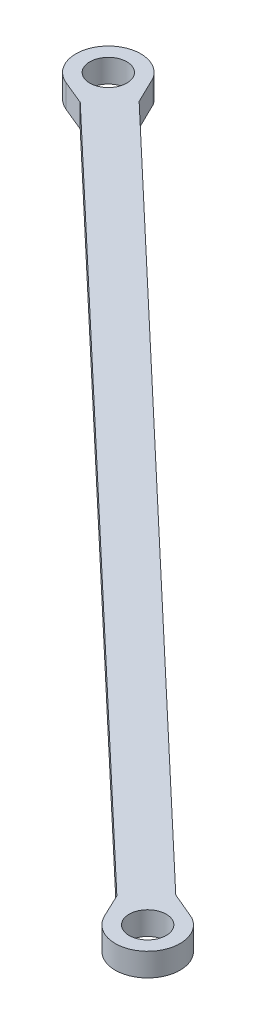
ISO-10303-21;
HEADER;
FILE_DESCRIPTION(('STEP AP214'),'2;1');
FILE_NAME('part.step','',(''),(''),'','','');
FILE_SCHEMA(('AUTOMOTIVE_DESIGN { 1 0 10303 214 1 1 1 1 }'));
ENDSEC;
DATA;
#1=APPLICATION_CONTEXT('core data for automotive mechanical design processes');
#2=APPLICATION_PROTOCOL_DEFINITION('international standard','automotive_design',2000,#1);
#3=PRODUCT_CONTEXT('',#1,'mechanical');
#4=PRODUCT('Part','Part','',(#3));
#5=PRODUCT_RELATED_PRODUCT_CATEGORY('part','',(#4));
#6=PRODUCT_DEFINITION_FORMATION('','',#4);
#7=PRODUCT_DEFINITION_CONTEXT('part definition',#1,'design');
#8=PRODUCT_DEFINITION('design','',#6,#7);
#9=PRODUCT_DEFINITION_SHAPE('','',#8);
#10=(LENGTH_UNIT() NAMED_UNIT(*) SI_UNIT(.MILLI.,.METRE.));
#11=(NAMED_UNIT(*) PLANE_ANGLE_UNIT() SI_UNIT($,.RADIAN.));
#12=(NAMED_UNIT(*) SI_UNIT($,.STERADIAN.) SOLID_ANGLE_UNIT());
#13=UNCERTAINTY_MEASURE_WITH_UNIT(LENGTH_MEASURE(1.E-05),#10,'distance_accuracy_value','');
#14=(GEOMETRIC_REPRESENTATION_CONTEXT(3) GLOBAL_UNCERTAINTY_ASSIGNED_CONTEXT((#13)) GLOBAL_UNIT_ASSIGNED_CONTEXT((#10,
#11,#12)) REPRESENTATION_CONTEXT('',''));
#15=CARTESIAN_POINT('',(0.,0.,0.));
#16=DIRECTION('',(0.,0.,1.));
#17=DIRECTION('',(1.,0.,0.));
#18=AXIS2_PLACEMENT_3D('',#15,#16,#17);
#19=CARTESIAN_POINT('',(-84.9502127526354,5.,-62.4655358947094));
#20=DIRECTION('',(0.,-1.,0.));
#21=DIRECTION('',(0.,0.,-1.));
#22=AXIS2_PLACEMENT_3D('',#19,#20,#21);
#23=CYLINDRICAL_SURFACE('',#22,7.);
#24=CARTESIAN_POINT('',(-84.9502127526354,0.,-62.4655358947094));
#25=DIRECTION('',(0.,1.,0.));
#26=DIRECTION('',(0.,0.,1.));
#27=AXIS2_PLACEMENT_3D('',#24,#25,#26);
#28=CIRCLE('',#27,7.);
#29=CARTESIAN_POINT('',(-79.0797574527234,0.,-66.2783766429882));
#30=VERTEX_POINT('',#29);
#31=CARTESIAN_POINT('',(-87.6194900154727,0.,-55.9944495180568));
#32=VERTEX_POINT('',#31);
#33=EDGE_CURVE('E141',#30,#32,#28,.T.);
#34=ORIENTED_EDGE('',*,*,#33,.T.);
#35=DIRECTION('',(0.,-1.,0.));
#36=VECTOR('',#35,1.);
#37=CARTESIAN_POINT('',(-87.6194900154727,5.,-55.9944495180568));
#38=LINE('',#37,#36);
#39=CARTESIAN_POINT('',(-87.6194900154727,5.,-55.9944495180568));
#40=VERTEX_POINT('',#39);
#41=EDGE_CURVE('E11',#40,#32,#38,.T.);
#42=ORIENTED_EDGE('',*,*,#41,.F.);
#43=CARTESIAN_POINT('',(-84.9502127526354,5.,-62.4655358947094));
#44=DIRECTION('',(0.,1.,0.));
#45=DIRECTION('',(0.,0.,1.));
#46=AXIS2_PLACEMENT_3D('',#43,#44,#45);
#47=CIRCLE('',#46,7.);
#48=CARTESIAN_POINT('',(-79.0797574527234,5.,-66.2783766429882));
#49=VERTEX_POINT('',#48);
#50=EDGE_CURVE('E186',#49,#40,#47,.T.);
#51=ORIENTED_EDGE('',*,*,#50,.F.);
#52=DIRECTION('',(0.,-1.,0.));
#53=VECTOR('',#52,1.);
#54=CARTESIAN_POINT('',(-79.0797574527234,5.,-66.2783766429882));
#55=LINE('',#54,#53);
#56=EDGE_CURVE('E54',#49,#30,#55,.T.);
#57=ORIENTED_EDGE('',*,*,#56,.T.);
#58=EDGE_LOOP('',(#34,#42,#51,#57));
#59=FACE_BOUND('',#58,.T.);
#60=ADVANCED_FACE('F37',(#59),#23,.T.);
#61=CARTESIAN_POINT('',(6.9980936069278,5.,-16.965366930146));
#62=DIRECTION('',(0.381325323262473,0.,-0.924440910950381));
#63=DIRECTION('',(-0.924440910950381,0.,-0.381325323262473));
#64=AXIS2_PLACEMENT_3D('',#61,#62,#63);
#65=PLANE('',#64);
#66=DIRECTION('',(0.924440910950381,0.,0.381325323262473));
#67=VECTOR('',#66,1.);
#68=CARTESIAN_POINT('',(6.9980936069278,0.,-16.965366930146));
#69=LINE('',#68,#67);
#70=CARTESIAN_POINT('',(-82.3900625199584,0.,-53.8373477427204));
#71=VERTEX_POINT('',#70);
#72=EDGE_CURVE('E143',#32,#71,#69,.T.);
#73=ORIENTED_EDGE('',*,*,#72,.T.);
#74=DIRECTION('',(0.,-1.,0.));
#75=VECTOR('',#74,1.);
#76=CARTESIAN_POINT('',(-82.3900625199584,5.,-53.8373477427204));
#77=LINE('',#76,#75);
#78=CARTESIAN_POINT('',(-82.3900625199584,5.,-53.8373477427204));
#79=VERTEX_POINT('',#78);
#80=EDGE_CURVE('E46',#79,#71,#77,.T.);
#81=ORIENTED_EDGE('',*,*,#80,.F.);
#82=DIRECTION('',(0.924440910950381,0.,0.381325323262473));
#83=VECTOR('',#82,1.);
#84=CARTESIAN_POINT('',(6.9980936069278,5.,-16.965366930146));
#85=LINE('',#84,#83);
#86=EDGE_CURVE('E92',#40,#79,#85,.T.);
#87=ORIENTED_EDGE('',*,*,#86,.F.);
#88=ORIENTED_EDGE('',*,*,#41,.T.);
#89=EDGE_LOOP('',(#73,#81,#87,#88));
#90=FACE_BOUND('',#89,.T.);
#91=ADVANCED_FACE('F215',(#90),#65,.F.);
#92=CARTESIAN_POINT('',(-12.1203333633261,5.,12.7840659046511));
#93=DIRECTION('',(0.688017223548878,0.,-0.725694357219411));
#94=DIRECTION('',(-0.725694357219411,0.,-0.688017223548878));
#95=AXIS2_PLACEMENT_3D('',#92,#93,#94);
#96=PLANE('',#95);
#97=DIRECTION('',(0.725694357219411,0.,0.688017223548878));
#98=VECTOR('',#97,1.);
#99=CARTESIAN_POINT('',(-12.1203333633261,0.,12.7840659046511));
#100=LINE('',#99,#98);
#101=CARTESIAN_POINT('',(70.0057524961178,0.,90.6462692025439));
#102=VERTEX_POINT('',#101);
#103=EDGE_CURVE('E145',#71,#102,#100,.T.);
#104=ORIENTED_EDGE('',*,*,#103,.T.);
#105=DIRECTION('',(0.,-1.,0.));
#106=VECTOR('',#105,1.);
#107=CARTESIAN_POINT('',(70.0057524961178,5.,90.6462692025439));
#108=LINE('',#107,#106);
#109=CARTESIAN_POINT('',(70.0057524961178,5.,90.6462692025439));
#110=VERTEX_POINT('',#109);
#111=EDGE_CURVE('E166',#110,#102,#108,.T.);
#112=ORIENTED_EDGE('',*,*,#111,.F.);
#113=DIRECTION('',(0.725694357219411,0.,0.688017223548878));
#114=VECTOR('',#113,1.);
#115=CARTESIAN_POINT('',(-12.1203333633261,5.,12.7840659046511));
#116=LINE('',#115,#114);
#117=EDGE_CURVE('E173',#79,#110,#116,.T.);
#118=ORIENTED_EDGE('',*,*,#117,.F.);
#119=ORIENTED_EDGE('',*,*,#80,.T.);
#120=EDGE_LOOP('',(#104,#112,#118,#119));
#121=FACE_BOUND('',#120,.T.);
#122=ADVANCED_FACE('F171',(#121),#96,.F.);
#123=CARTESIAN_POINT('',(21.8683573127353,5.,-10.4161898300447));
#124=DIRECTION('',(-0.902817464803124,0.,0.430023982175949));
#125=DIRECTION('',(0.430023982175949,0.,0.902817464803124));
#126=AXIS2_PLACEMENT_3D('',#123,#124,#125);
#127=PLANE('',#126);
#128=DIRECTION('',(-0.430023982175949,0.,-0.902817464803124));
#129=VECTOR('',#128,1.);
#130=CARTESIAN_POINT('',(21.8683573127353,0.,-10.4161898300447));
#131=LINE('',#130,#129);
#132=CARTESIAN_POINT('',(72.4383354870735,0.,95.7533760148314));
#133=VERTEX_POINT('',#132);
#134=EDGE_CURVE('E148',#133,#102,#131,.T.);
#135=ORIENTED_EDGE('',*,*,#134,.F.);
#136=DIRECTION('',(0.,-1.,0.));
#137=VECTOR('',#136,1.);
#138=CARTESIAN_POINT('',(72.4383354870735,5.,95.7533760148314));
#139=LINE('',#138,#137);
#140=CARTESIAN_POINT('',(72.4383354870735,5.,95.7533760148314));
#141=VERTEX_POINT('',#140);
#142=EDGE_CURVE('E164',#141,#133,#139,.T.);
#143=ORIENTED_EDGE('',*,*,#142,.F.);
#144=DIRECTION('',(-0.430023982175949,0.,-0.902817464803124));
#145=VECTOR('',#144,1.);
#146=CARTESIAN_POINT('',(21.8683573127353,5.,-10.4161898300447));
#147=LINE('',#146,#145);
#148=EDGE_CURVE('E181',#141,#110,#147,.T.);
#149=ORIENTED_EDGE('',*,*,#148,.T.);
#150=ORIENTED_EDGE('',*,*,#111,.T.);
#151=EDGE_LOOP('',(#135,#143,#149,#150));
#152=FACE_BOUND('',#151,.T.);
#153=ADVANCED_FACE('F179',(#152),#127,.T.);
#154=CARTESIAN_POINT('',(78.7580577406953,5.,92.7432081395998));
#155=DIRECTION('',(0.,-1.,0.));
#156=DIRECTION('',(0.,0.,-1.));
#157=AXIS2_PLACEMENT_3D('',#154,#155,#156);
#158=CYLINDRICAL_SURFACE('',#157,7.00000000000001);
#159=CARTESIAN_POINT('',(78.7580577406953,0.,92.7432081395998));
#160=DIRECTION('',(0.,1.,0.));
#161=DIRECTION('',(0.,0.,1.));
#162=AXIS2_PLACEMENT_3D('',#159,#160,#161);
#163=CIRCLE('',#162,7.00000000000001);
#164=CARTESIAN_POINT('',(82.2527984538102,0.,86.6779969027097));
#165=VERTEX_POINT('',#164);
#166=EDGE_CURVE('E151',#165,#133,#163,.F.);
#167=ORIENTED_EDGE('',*,*,#166,.F.);
#168=DIRECTION('',(0.,-1.,0.));
#169=VECTOR('',#168,1.);
#170=CARTESIAN_POINT('',(82.2527984538102,5.,86.6779969027097));
#171=LINE('',#170,#169);
#172=CARTESIAN_POINT('',(82.2527984538102,5.,86.6779969027097));
#173=VERTEX_POINT('',#172);
#174=EDGE_CURVE('E127',#173,#165,#171,.T.);
#175=ORIENTED_EDGE('',*,*,#174,.F.);
#176=CARTESIAN_POINT('',(78.7580577406953,5.,92.7432081395998));
#177=DIRECTION('',(0.,1.,0.));
#178=DIRECTION('',(0.,0.,1.));
#179=AXIS2_PLACEMENT_3D('',#176,#177,#178);
#180=CIRCLE('',#179,7.00000000000001);
#181=EDGE_CURVE('E117',#173,#141,#180,.F.);
#182=ORIENTED_EDGE('',*,*,#181,.T.);
#183=ORIENTED_EDGE('',*,*,#142,.T.);
#184=EDGE_LOOP('',(#167,#175,#182,#183));
#185=FACE_BOUND('',#184,.T.);
#186=ADVANCED_FACE('F225',(#185),#158,.T.);
#187=CARTESIAN_POINT('',(-18.6166961542364,5.,43.9809131007848));
#188=DIRECTION('',(-0.389806690371797,0.,0.920896706553664));
#189=DIRECTION('',(0.920896706553664,0.,0.389806690371797));
#190=AXIS2_PLACEMENT_3D('',#187,#188,#189);
#191=PLANE('',#190);
#192=DIRECTION('',(-0.920896706553664,0.,-0.389806690371797));
#193=VECTOR('',#192,1.);
#194=CARTESIAN_POINT('',(-18.6166961542364,0.,43.9809131007848));
#195=LINE('',#194,#193);
#196=CARTESIAN_POINT('',(76.1979075080577,0.,84.1150199875692));
#197=VERTEX_POINT('',#196);
#198=EDGE_CURVE('E124',#165,#197,#195,.T.);
#199=ORIENTED_EDGE('',*,*,#198,.T.);
#200=DIRECTION('',(0.,-1.,0.));
#201=VECTOR('',#200,1.);
#202=CARTESIAN_POINT('',(76.1979075080577,5.,84.1150199875692));
#203=LINE('',#202,#201);
#204=CARTESIAN_POINT('',(76.1979075080577,5.,84.1150199875692));
#205=VERTEX_POINT('',#204);
#206=EDGE_CURVE('E121',#205,#197,#203,.T.);
#207=ORIENTED_EDGE('',*,*,#206,.F.);
#208=DIRECTION('',(-0.920896706553664,0.,-0.389806690371797));
#209=VECTOR('',#208,1.);
#210=CARTESIAN_POINT('',(-18.6166961542364,5.,43.9809131007848));
#211=LINE('',#210,#209);
#212=EDGE_CURVE('E109',#173,#205,#211,.T.);
#213=ORIENTED_EDGE('',*,*,#212,.F.);
#214=ORIENTED_EDGE('',*,*,#174,.T.);
#215=EDGE_LOOP('',(#199,#207,#213,#214));
#216=FACE_BOUND('',#215,.T.);
#217=ADVANCED_FACE('F122',(#216),#191,.F.);
#218=CARTESIAN_POINT('',(-5.92817835138624,5.,6.25281668967643));
#219=DIRECTION('',(0.688017223548878,0.,-0.725694357219411));
#220=DIRECTION('',(-0.725694357219411,0.,-0.688017223548878));
#221=AXIS2_PLACEMENT_3D('',#218,#219,#220);
#222=PLANE('',#221);
#223=DIRECTION('',(0.725694357219411,0.,0.688017223548878));
#224=VECTOR('',#223,1.);
#225=CARTESIAN_POINT('',(-5.92817835138624,0.,6.25281668967643));
#226=LINE('',#225,#224);
#227=CARTESIAN_POINT('',(-76.1979075080185,0.,-60.3685969576951));
#228=VERTEX_POINT('',#227);
#229=EDGE_CURVE('E155',#228,#197,#226,.T.);
#230=ORIENTED_EDGE('',*,*,#229,.F.);
#231=DIRECTION('',(0.,-1.,0.));
#232=VECTOR('',#231,1.);
#233=CARTESIAN_POINT('',(-76.1979075080185,5.,-60.3685969576951));
#234=LINE('',#233,#232);
#235=CARTESIAN_POINT('',(-76.1979075080185,5.,-60.3685969576951));
#236=VERTEX_POINT('',#235);
#237=EDGE_CURVE('E80',#236,#228,#234,.T.);
#238=ORIENTED_EDGE('',*,*,#237,.F.);
#239=DIRECTION('',(0.725694357219411,0.,0.688017223548878));
#240=VECTOR('',#239,1.);
#241=CARTESIAN_POINT('',(-5.92817835138624,5.,6.25281668967643));
#242=LINE('',#241,#240);
#243=EDGE_CURVE('E114',#236,#205,#242,.T.);
#244=ORIENTED_EDGE('',*,*,#243,.T.);
#245=ORIENTED_EDGE('',*,*,#206,.T.);
#246=EDGE_LOOP('',(#230,#238,#244,#245));
#247=FACE_BOUND('',#246,.T.);
#248=ADVANCED_FACE('F129',(#247),#222,.T.);
#249=CARTESIAN_POINT('',(-84.9502127526354,5.,-62.4655358947094));
#250=DIRECTION('',(0.,-1.,0.));
#251=DIRECTION('',(0.,0.,-1.));
#252=AXIS2_PLACEMENT_3D('',#249,#250,#251);
#253=CYLINDRICAL_SURFACE('',#252,4.00000000000001);
#254=CARTESIAN_POINT('',(-84.9502127526354,5.,-62.4655358947094));
#255=DIRECTION('',(0.,1.,0.));
#256=DIRECTION('',(0.,0.,1.));
#257=AXIS2_PLACEMENT_3D('',#254,#255,#256);
#258=CIRCLE('',#257,4.00000000000001);
#259=CARTESIAN_POINT('',(-84.9502127526354,5.,-58.4655358947094));
#260=VERTEX_POINT('',#259);
#261=EDGE_CURVE('E188',#260,#260,#258,.T.);
#262=ORIENTED_EDGE('',*,*,#261,.T.);
#263=EDGE_LOOP('',(#262));
#264=FACE_BOUND('',#263,.T.);
#265=CARTESIAN_POINT('',(-84.9502127526354,0.,-62.4655358947094));
#266=DIRECTION('',(0.,1.,0.));
#267=DIRECTION('',(0.,0.,1.));
#268=AXIS2_PLACEMENT_3D('',#265,#266,#267);
#269=CIRCLE('',#268,4.00000000000001);
#270=CARTESIAN_POINT('',(-84.9502127526354,0.,-58.4655358947094));
#271=VERTEX_POINT('',#270);
#272=EDGE_CURVE('E138',#271,#271,#269,.T.);
#273=ORIENTED_EDGE('',*,*,#272,.F.);
#274=EDGE_LOOP('',(#273));
#275=FACE_BOUND('',#274,.T.);
#276=ADVANCED_FACE('F199',(#264,#275),#253,.F.);
#277=CARTESIAN_POINT('',(78.7580577406953,5.,92.7432081395998));
#278=DIRECTION('',(0.,-1.,0.));
#279=DIRECTION('',(0.,0.,-1.));
#280=AXIS2_PLACEMENT_3D('',#277,#278,#279);
#281=CYLINDRICAL_SURFACE('',#280,4.00000000000001);
#282=CARTESIAN_POINT('',(78.7580577406953,5.,92.7432081395998));
#283=DIRECTION('',(0.,1.,0.));
#284=DIRECTION('',(0.,0.,1.));
#285=AXIS2_PLACEMENT_3D('',#282,#283,#284);
#286=CIRCLE('',#285,4.00000000000001);
#287=CARTESIAN_POINT('',(78.7580577406953,5.,96.7432081395998));
#288=VERTEX_POINT('',#287);
#289=EDGE_CURVE('E160',#288,#288,#286,.F.);
#290=ORIENTED_EDGE('',*,*,#289,.F.);
#291=EDGE_LOOP('',(#290));
#292=FACE_BOUND('',#291,.T.);
#293=CARTESIAN_POINT('',(78.7580577406953,0.,92.7432081395998));
#294=DIRECTION('',(0.,1.,0.));
#295=DIRECTION('',(0.,0.,1.));
#296=AXIS2_PLACEMENT_3D('',#293,#294,#295);
#297=CIRCLE('',#296,4.00000000000001);
#298=CARTESIAN_POINT('',(78.7580577406953,0.,96.7432081395998));
#299=VERTEX_POINT('',#298);
#300=EDGE_CURVE('E135',#299,#299,#297,.F.);
#301=ORIENTED_EDGE('',*,*,#300,.T.);
#302=EDGE_LOOP('',(#301));
#303=FACE_BOUND('',#302,.T.);
#304=ADVANCED_FACE('F39',(#292,#303),#281,.F.);
#305=CARTESIAN_POINT('',(-37.776665154032,5.,18.421444822419));
#306=DIRECTION('',(0.89882653501166,0.,-0.438304528791264));
#307=DIRECTION('',(-0.438304528791265,0.,-0.89882653501166));
#308=AXIS2_PLACEMENT_3D('',#305,#306,#307);
#309=PLANE('',#308);
#310=DIRECTION('',(0.438304528791265,0.,0.898826535011661));
#311=VECTOR('',#310,1.);
#312=CARTESIAN_POINT('',(-37.776665154032,0.,18.421444822419));
#313=LINE('',#312,#311);
#314=EDGE_CURVE('E157',#30,#228,#313,.T.);
#315=ORIENTED_EDGE('',*,*,#314,.F.);
#316=ORIENTED_EDGE('',*,*,#56,.F.);
#317=DIRECTION('',(0.438304528791265,0.,0.898826535011661));
#318=VECTOR('',#317,1.);
#319=CARTESIAN_POINT('',(-37.776665154032,5.,18.421444822419));
#320=LINE('',#319,#318);
#321=EDGE_CURVE('E130',#49,#236,#320,.T.);
#322=ORIENTED_EDGE('',*,*,#321,.T.);
#323=ORIENTED_EDGE('',*,*,#237,.T.);
#324=EDGE_LOOP('',(#315,#316,#322,#323));
#325=FACE_BOUND('',#324,.T.);
#326=ADVANCED_FACE('F198',(#325),#309,.T.);
#327=CARTESIAN_POINT('',(0.,5.,0.));
#328=DIRECTION('',(0.,1.,0.));
#329=DIRECTION('',(0.,0.,1.));
#330=AXIS2_PLACEMENT_3D('',#327,#328,#329);
#331=PLANE('',#330);
#332=ORIENTED_EDGE('',*,*,#289,.T.);
#333=EDGE_LOOP('',(#332));
#334=FACE_BOUND('',#333,.T.);
#335=ORIENTED_EDGE('',*,*,#261,.F.);
#336=EDGE_LOOP('',(#335));
#337=FACE_BOUND('',#336,.T.);
#338=ORIENTED_EDGE('',*,*,#50,.T.);
#339=ORIENTED_EDGE('',*,*,#86,.T.);
#340=ORIENTED_EDGE('',*,*,#117,.T.);
#341=ORIENTED_EDGE('',*,*,#148,.F.);
#342=ORIENTED_EDGE('',*,*,#181,.F.);
#343=ORIENTED_EDGE('',*,*,#212,.T.);
#344=ORIENTED_EDGE('',*,*,#243,.F.);
#345=ORIENTED_EDGE('',*,*,#321,.F.);
#346=EDGE_LOOP('',(#338,#339,#340,#341,#342,#343,#344,#345));
#347=FACE_BOUND('',#346,.T.);
#348=ADVANCED_FACE('F111',(#334,#337,#347),#331,.T.);
#349=CARTESIAN_POINT('',(0.,0.,0.));
#350=DIRECTION('',(0.,1.,0.));
#351=DIRECTION('',(0.,0.,1.));
#352=AXIS2_PLACEMENT_3D('',#349,#350,#351);
#353=PLANE('',#352);
#354=ORIENTED_EDGE('',*,*,#300,.F.);
#355=EDGE_LOOP('',(#354));
#356=FACE_BOUND('',#355,.T.);
#357=ORIENTED_EDGE('',*,*,#272,.T.);
#358=EDGE_LOOP('',(#357));
#359=FACE_BOUND('',#358,.T.);
#360=ORIENTED_EDGE('',*,*,#33,.F.);
#361=ORIENTED_EDGE('',*,*,#314,.T.);
#362=ORIENTED_EDGE('',*,*,#229,.T.);
#363=ORIENTED_EDGE('',*,*,#198,.F.);
#364=ORIENTED_EDGE('',*,*,#166,.T.);
#365=ORIENTED_EDGE('',*,*,#134,.T.);
#366=ORIENTED_EDGE('',*,*,#103,.F.);
#367=ORIENTED_EDGE('',*,*,#72,.F.);
#368=EDGE_LOOP('',(#360,#361,#362,#363,#364,#365,#366,#367));
#369=FACE_BOUND('',#368,.T.);
#370=ADVANCED_FACE('F175',(#356,#359,#369),#353,.F.);
#371=CLOSED_SHELL('',(#60,#91,#122,#153,#186,#217,#248,#276,#304,#326,#348,#370));
#372=MANIFOLD_SOLID_BREP('B2',#371);
#373=ADVANCED_BREP_SHAPE_REPRESENTATION('',(#18,#372),#14);
#374=SHAPE_DEFINITION_REPRESENTATION(#9,#373);
ENDSEC;
END-ISO-10303-21;
